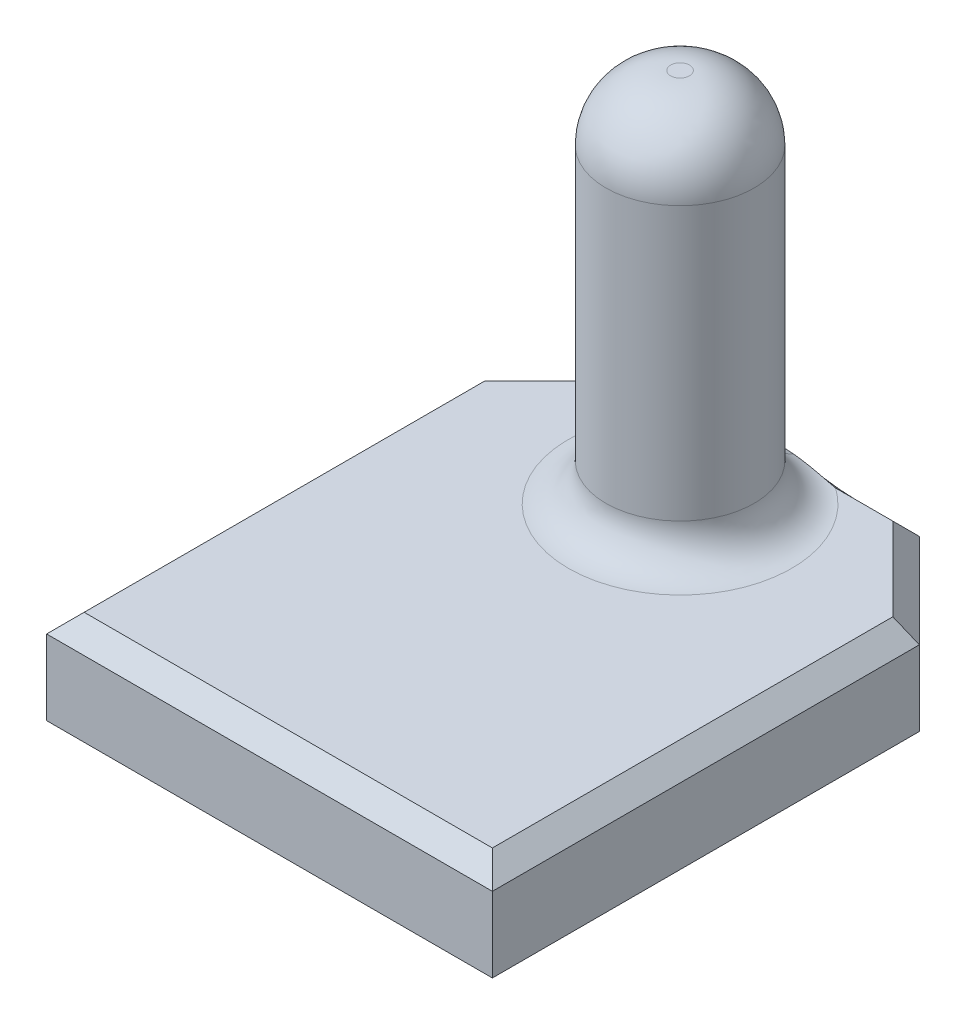
ISO-10303-21;
HEADER;
FILE_DESCRIPTION(('STEP AP214'),'2;1');
FILE_NAME('part.step','',(''),(''),'','','');
FILE_SCHEMA(('AUTOMOTIVE_DESIGN { 1 0 10303 214 1 1 1 1 }'));
ENDSEC;
DATA;
#1=APPLICATION_CONTEXT('core data for automotive mechanical design processes');
#2=APPLICATION_PROTOCOL_DEFINITION('international standard','automotive_design',2000,#1);
#3=PRODUCT_CONTEXT('',#1,'mechanical');
#4=PRODUCT('Part','Part','',(#3));
#5=PRODUCT_RELATED_PRODUCT_CATEGORY('part','',(#4));
#6=PRODUCT_DEFINITION_FORMATION('','',#4);
#7=PRODUCT_DEFINITION_CONTEXT('part definition',#1,'design');
#8=PRODUCT_DEFINITION('design','',#6,#7);
#9=PRODUCT_DEFINITION_SHAPE('','',#8);
#10=(LENGTH_UNIT() NAMED_UNIT(*) SI_UNIT(.MILLI.,.METRE.));
#11=(NAMED_UNIT(*) PLANE_ANGLE_UNIT() SI_UNIT($,.RADIAN.));
#12=(NAMED_UNIT(*) SI_UNIT($,.STERADIAN.) SOLID_ANGLE_UNIT());
#13=UNCERTAINTY_MEASURE_WITH_UNIT(LENGTH_MEASURE(1.E-05),#10,'distance_accuracy_value','');
#14=(GEOMETRIC_REPRESENTATION_CONTEXT(3) GLOBAL_UNCERTAINTY_ASSIGNED_CONTEXT((#13)) GLOBAL_UNIT_ASSIGNED_CONTEXT((#10,
#11,#12)) REPRESENTATION_CONTEXT('',''));
#15=CARTESIAN_POINT('',(0.,0.,0.));
#16=DIRECTION('',(0.,0.,1.));
#17=DIRECTION('',(1.,0.,0.));
#18=AXIS2_PLACEMENT_3D('',#15,#16,#17);
#19=CARTESIAN_POINT('',(11.875,5.,13.875));
#20=DIRECTION('',(-1.,0.,0.));
#21=DIRECTION('',(0.,0.,1.));
#22=AXIS2_PLACEMENT_3D('',#19,#20,#21);
#23=PLANE('',#22);
#24=DIRECTION('',(0.,1.,0.));
#25=VECTOR('',#24,1.);
#26=CARTESIAN_POINT('',(11.875,5.,-8.87499999999998));
#27=LINE('',#26,#25);
#28=CARTESIAN_POINT('',(11.875,0.,-8.87499999999998));
#29=VERTEX_POINT('',#28);
#30=CARTESIAN_POINT('',(11.875,4.00000000000001,-8.87499999999998));
#31=VERTEX_POINT('',#30);
#32=EDGE_CURVE('E503',#29,#31,#27,.T.);
#33=ORIENTED_EDGE('',*,*,#32,.T.);
#34=DIRECTION('',(0.,0.,1.));
#35=VECTOR('',#34,1.);
#36=CARTESIAN_POINT('',(11.875,4.00000000000001,13.875));
#37=LINE('',#36,#35);
#38=CARTESIAN_POINT('',(11.875,4.00000000000001,13.875));
#39=VERTEX_POINT('',#38);
#40=EDGE_CURVE('E320',#31,#39,#37,.T.);
#41=ORIENTED_EDGE('',*,*,#40,.T.);
#42=DIRECTION('',(0.,-1.,0.));
#43=VECTOR('',#42,1.);
#44=CARTESIAN_POINT('',(11.875,5.,13.875));
#45=LINE('',#44,#43);
#46=CARTESIAN_POINT('',(11.875,0.,13.875));
#47=VERTEX_POINT('',#46);
#48=EDGE_CURVE('E158',#39,#47,#45,.T.);
#49=ORIENTED_EDGE('',*,*,#48,.T.);
#50=DIRECTION('',(0.,0.,-1.));
#51=VECTOR('',#50,1.);
#52=CARTESIAN_POINT('',(11.875,0.,13.875));
#53=LINE('',#52,#51);
#54=EDGE_CURVE('E170',#47,#29,#53,.T.);
#55=ORIENTED_EDGE('',*,*,#54,.T.);
#56=EDGE_LOOP('',(#33,#41,#49,#55));
#57=FACE_BOUND('',#56,.T.);
#58=ADVANCED_FACE('F47',(#57),#23,.F.);
#59=CARTESIAN_POINT('',(-11.875,5.,-13.875));
#60=DIRECTION('',(0.,0.,1.));
#61=DIRECTION('',(1.,0.,0.));
#62=AXIS2_PLACEMENT_3D('',#59,#60,#61);
#63=PLANE('',#62);
#64=CARTESIAN_POINT('',(3.41128641424315,4.00000000000001,-13.875));
#65=CARTESIAN_POINT('',(3.19115001990857,4.00000008711006,-13.875));
#66=CARTESIAN_POINT('',(2.97154695151907,4.00796390785185,-13.875));
#67=CARTESIAN_POINT('',(2.53297878569037,4.03341786411443,-13.875));
#68=CARTESIAN_POINT('',(2.31401396208884,4.05091208841774,-13.875));
#69=CARTESIAN_POINT('',(1.87628490233183,4.08889575065868,-13.875));
#70=CARTESIAN_POINT('',(1.65751822908087,4.10934879344183,-13.875));
#71=CARTESIAN_POINT('',(1.21975158726292,4.1467712798864,-13.875));
#72=CARTESIAN_POINT('',(1.00074810064412,4.16368817636872,-13.875));
#73=CARTESIAN_POINT('',(0.781444170076225,4.17611878517583,-13.875));
#74=B_SPLINE_CURVE_WITH_KNOTS('',3,(#64,#65,#66,#67,#68,#69,#70,#71,#72,#73),.UNSPECIFIED.,.F.,
.F.,(4,2,2,2,4),(0.,0.000658933231428684,0.00131786646285737,0.00197679969428605,
0.00263573292571474),.UNSPECIFIED.);
#75=CARTESIAN_POINT('',(0.781444170076225,4.17611878517583,-13.875));
#76=VERTEX_POINT('',#75);
#77=CARTESIAN_POINT('',(3.41128641424315,4.00000000000001,-13.875));
#78=VERTEX_POINT('',#77);
#79=EDGE_CURVE('E286',#76,#78,#74,.F.);
#80=ORIENTED_EDGE('',*,*,#79,.T.);
#81=DIRECTION('',(1.,0.,0.));
#82=VECTOR('',#81,1.);
#83=CARTESIAN_POINT('',(-11.875,4.00000000000001,-13.875));
#84=LINE('',#83,#82);
#85=CARTESIAN_POINT('',(6.87500000000001,4.00000000000001,-13.875));
#86=VERTEX_POINT('',#85);
#87=EDGE_CURVE('E291',#78,#86,#84,.T.);
#88=ORIENTED_EDGE('',*,*,#87,.T.);
#89=DIRECTION('',(0.,-1.,0.));
#90=VECTOR('',#89,1.);
#91=CARTESIAN_POINT('',(6.87500000000001,5.,-13.875));
#92=LINE('',#91,#90);
#93=CARTESIAN_POINT('',(6.87500000000001,0.,-13.875));
#94=VERTEX_POINT('',#93);
#95=EDGE_CURVE('E533',#86,#94,#92,.T.);
#96=ORIENTED_EDGE('',*,*,#95,.T.);
#97=DIRECTION('',(-1.,0.,0.));
#98=VECTOR('',#97,1.);
#99=CARTESIAN_POINT('',(-11.875,0.,-13.875));
#100=LINE('',#99,#98);
#101=CARTESIAN_POINT('',(-6.87499999999999,0.,-13.875));
#102=VERTEX_POINT('',#101);
#103=EDGE_CURVE('E166',#94,#102,#100,.T.);
#104=ORIENTED_EDGE('',*,*,#103,.T.);
#105=DIRECTION('',(0.,1.,0.));
#106=VECTOR('',#105,1.);
#107=CARTESIAN_POINT('',(-6.87499999999999,5.,-13.875));
#108=LINE('',#107,#106);
#109=CARTESIAN_POINT('',(-6.87499999999999,4.00000000000001,-13.875));
#110=VERTEX_POINT('',#109);
#111=EDGE_CURVE('E508',#102,#110,#108,.T.);
#112=ORIENTED_EDGE('',*,*,#111,.T.);
#113=DIRECTION('',(1.,0.,0.));
#114=VECTOR('',#113,1.);
#115=CARTESIAN_POINT('',(-11.875,4.00000000000001,-13.875));
#116=LINE('',#115,#114);
#117=CARTESIAN_POINT('',(-3.41128641424316,4.00000000000001,-13.875));
#118=VERTEX_POINT('',#117);
#119=EDGE_CURVE('E259',#110,#118,#116,.T.);
#120=ORIENTED_EDGE('',*,*,#119,.T.);
#121=CARTESIAN_POINT('',(-0.781444170076225,4.17611878517583,-13.875));
#122=CARTESIAN_POINT('',(-1.00074810064412,4.16368817636873,-13.875));
#123=CARTESIAN_POINT('',(-1.21975158726292,4.14677127988637,-13.875));
#124=CARTESIAN_POINT('',(-1.65751822908087,4.10934879344186,-13.875));
#125=CARTESIAN_POINT('',(-1.87628490233183,4.08889575065866,-13.875));
#126=CARTESIAN_POINT('',(-2.31401396208884,4.05091208841776,-13.875));
#127=CARTESIAN_POINT('',(-2.53297878569038,4.03341786411443,-13.875));
#128=CARTESIAN_POINT('',(-2.97154695151907,4.00796390785185,-13.875));
#129=CARTESIAN_POINT('',(-3.19115001990858,4.00000008711006,-13.875));
#130=CARTESIAN_POINT('',(-3.41128641424316,4.00000000000001,-13.875));
#131=B_SPLINE_CURVE_WITH_KNOTS('',3,(#121,#122,#123,#124,#125,#126,#127,#128,#129,#130),
.UNSPECIFIED.,.F.,.F.,(4,2,2,2,4),(0.,0.000658933231428685,0.00131786646285737,
0.00197679969428605,0.00263573292571474),.UNSPECIFIED.);
#132=CARTESIAN_POINT('',(-0.781444170076225,4.17611878517583,-13.875));
#133=VERTEX_POINT('',#132);
#134=EDGE_CURVE('E254',#118,#133,#131,.F.);
#135=ORIENTED_EDGE('',*,*,#134,.T.);
#136=CARTESIAN_POINT('',(0.781444170076225,4.17611878517583,-13.875));
#137=CARTESIAN_POINT('',(0.520962780050819,4.19086411335815,-13.875));
#138=CARTESIAN_POINT('',(0.260481392587462,4.1978121142284,-13.875));
#139=CARTESIAN_POINT('',(-0.260481392587462,4.19781211422842,-13.875));
#140=CARTESIAN_POINT('',(-0.520962780050816,4.19086411335814,-13.875));
#141=CARTESIAN_POINT('',(-0.781444170076227,4.17611878517583,-13.875));
#142=B_SPLINE_CURVE_WITH_KNOTS('',3,(#136,#137,#138,#139,#140,#141),.UNSPECIFIED.,.F.,.F.,(4,2,
4),(0.,0.000781444170076226,0.00156288834015245),.UNSPECIFIED.);
#143=EDGE_CURVE('E611',#133,#76,#142,.F.);
#144=ORIENTED_EDGE('',*,*,#143,.T.);
#145=EDGE_LOOP('',(#80,#88,#96,#104,#112,#120,#135,#144));
#146=FACE_BOUND('',#145,.T.);
#147=ADVANCED_FACE('F261',(#146),#63,.F.);
#148=CARTESIAN_POINT('',(-11.875,5.,13.875));
#149=DIRECTION('',(1.,0.,0.));
#150=DIRECTION('',(0.,0.,-1.));
#151=AXIS2_PLACEMENT_3D('',#148,#149,#150);
#152=PLANE('',#151);
#153=DIRECTION('',(0.,-1.,0.));
#154=VECTOR('',#153,1.);
#155=CARTESIAN_POINT('',(-11.875,5.,13.875));
#156=LINE('',#155,#154);
#157=CARTESIAN_POINT('',(-11.875,4.00000000000001,13.875));
#158=VERTEX_POINT('',#157);
#159=CARTESIAN_POINT('',(-11.875,0.,13.875));
#160=VERTEX_POINT('',#159);
#161=EDGE_CURVE('E150',#158,#160,#156,.T.);
#162=ORIENTED_EDGE('',*,*,#161,.F.);
#163=DIRECTION('',(0.,0.,-1.));
#164=VECTOR('',#163,1.);
#165=CARTESIAN_POINT('',(-11.875,4.00000000000001,13.875));
#166=LINE('',#165,#164);
#167=CARTESIAN_POINT('',(-11.875,4.00000000000001,-8.87500000000001));
#168=VERTEX_POINT('',#167);
#169=EDGE_CURVE('E59',#158,#168,#166,.T.);
#170=ORIENTED_EDGE('',*,*,#169,.T.);
#171=DIRECTION('',(0.,-1.,0.));
#172=VECTOR('',#171,1.);
#173=CARTESIAN_POINT('',(-11.875,5.,-8.87500000000001));
#174=LINE('',#173,#172);
#175=CARTESIAN_POINT('',(-11.875,0.,-8.87500000000001));
#176=VERTEX_POINT('',#175);
#177=EDGE_CURVE('E163',#168,#176,#174,.T.);
#178=ORIENTED_EDGE('',*,*,#177,.T.);
#179=DIRECTION('',(0.,0.,1.));
#180=VECTOR('',#179,1.);
#181=CARTESIAN_POINT('',(-11.875,0.,13.875));
#182=LINE('',#181,#180);
#183=EDGE_CURVE('E161',#176,#160,#182,.T.);
#184=ORIENTED_EDGE('',*,*,#183,.T.);
#185=EDGE_LOOP('',(#162,#170,#178,#184));
#186=FACE_BOUND('',#185,.T.);
#187=ADVANCED_FACE('F162',(#186),#152,.F.);
#188=CARTESIAN_POINT('',(-11.875,5.,13.875));
#189=DIRECTION('',(0.,0.,-1.));
#190=DIRECTION('',(-1.,0.,0.));
#191=AXIS2_PLACEMENT_3D('',#188,#189,#190);
#192=PLANE('',#191);
#193=ORIENTED_EDGE('',*,*,#48,.F.);
#194=DIRECTION('',(-1.,0.,0.));
#195=VECTOR('',#194,1.);
#196=CARTESIAN_POINT('',(-11.875,4.00000000000001,13.875));
#197=LINE('',#196,#195);
#198=EDGE_CURVE('E74',#39,#158,#197,.T.);
#199=ORIENTED_EDGE('',*,*,#198,.T.);
#200=ORIENTED_EDGE('',*,*,#161,.T.);
#201=DIRECTION('',(1.,0.,0.));
#202=VECTOR('',#201,1.);
#203=CARTESIAN_POINT('',(-11.875,0.,13.875));
#204=LINE('',#203,#202);
#205=EDGE_CURVE('E154',#160,#47,#204,.T.);
#206=ORIENTED_EDGE('',*,*,#205,.T.);
#207=EDGE_LOOP('',(#193,#199,#200,#206));
#208=FACE_BOUND('',#207,.T.);
#209=ADVANCED_FACE('F152',(#208),#192,.F.);
#210=CARTESIAN_POINT('',(0.,5.,0.));
#211=DIRECTION('',(0.,-1.,0.));
#212=DIRECTION('',(0.,0.,-1.));
#213=AXIS2_PLACEMENT_3D('',#210,#211,#212);
#214=PLANE('',#213);
#215=DIRECTION('',(-0.707106781186546,0.,-0.707106781186549));
#216=VECTOR('',#215,1.);
#217=CARTESIAN_POINT('',(6.16789321881346,5.,-13.1678932188135));
#218=LINE('',#217,#216);
#219=CARTESIAN_POINT('',(10.875,5.,-8.46078643762689));
#220=VERTEX_POINT('',#219);
#221=CARTESIAN_POINT('',(6.46078643762691,5.,-12.875));
#222=VERTEX_POINT('',#221);
#223=EDGE_CURVE('E312',#220,#222,#218,.T.);
#224=ORIENTED_EDGE('',*,*,#223,.T.);
#225=DIRECTION('',(-1.,0.,0.));
#226=VECTOR('',#225,1.);
#227=CARTESIAN_POINT('',(0.,5.,-12.875));
#228=LINE('',#227,#226);
#229=CARTESIAN_POINT('',(3.41128641424316,5.,-12.875));
#230=VERTEX_POINT('',#229);
#231=EDGE_CURVE('E314',#222,#230,#228,.T.);
#232=ORIENTED_EDGE('',*,*,#231,.T.);
#233=CARTESIAN_POINT('',(0.,5.,-8.));
#234=DIRECTION('',(0.,-1.,0.));
#235=DIRECTION('',(0.,0.,-1.));
#236=AXIS2_PLACEMENT_3D('',#233,#234,#235);
#237=CIRCLE('',#236,5.95);
#238=CARTESIAN_POINT('',(-3.41128641424316,5.,-12.875));
#239=VERTEX_POINT('',#238);
#240=EDGE_CURVE('E191',#230,#239,#237,.T.);
#241=ORIENTED_EDGE('',*,*,#240,.T.);
#242=DIRECTION('',(-1.,0.,0.));
#243=VECTOR('',#242,1.);
#244=CARTESIAN_POINT('',(0.,5.,-12.875));
#245=LINE('',#244,#243);
#246=CARTESIAN_POINT('',(-6.4607864376269,5.,-12.875));
#247=VERTEX_POINT('',#246);
#248=EDGE_CURVE('E298',#239,#247,#245,.T.);
#249=ORIENTED_EDGE('',*,*,#248,.T.);
#250=DIRECTION('',(-0.707106781186549,0.,0.707106781186547));
#251=VECTOR('',#250,1.);
#252=CARTESIAN_POINT('',(-11.1678932188135,5.,-8.16789321881347));
#253=LINE('',#252,#251);
#254=CARTESIAN_POINT('',(-10.875,5.,-8.46078643762692));
#255=VERTEX_POINT('',#254);
#256=EDGE_CURVE('E302',#247,#255,#253,.T.);
#257=ORIENTED_EDGE('',*,*,#256,.T.);
#258=DIRECTION('',(0.,0.,1.));
#259=VECTOR('',#258,1.);
#260=CARTESIAN_POINT('',(-10.875,5.,0.));
#261=LINE('',#260,#259);
#262=CARTESIAN_POINT('',(-10.875,5.,12.875));
#263=VERTEX_POINT('',#262);
#264=EDGE_CURVE('E306',#255,#263,#261,.T.);
#265=ORIENTED_EDGE('',*,*,#264,.T.);
#266=DIRECTION('',(1.,0.,0.));
#267=VECTOR('',#266,1.);
#268=CARTESIAN_POINT('',(0.,5.,12.875));
#269=LINE('',#268,#267);
#270=CARTESIAN_POINT('',(10.875,5.,12.875));
#271=VERTEX_POINT('',#270);
#272=EDGE_CURVE('E308',#263,#271,#269,.T.);
#273=ORIENTED_EDGE('',*,*,#272,.T.);
#274=DIRECTION('',(0.,0.,-1.));
#275=VECTOR('',#274,1.);
#276=CARTESIAN_POINT('',(10.875,5.,0.));
#277=LINE('',#276,#275);
#278=EDGE_CURVE('E310',#271,#220,#277,.T.);
#279=ORIENTED_EDGE('',*,*,#278,.T.);
#280=EDGE_LOOP('',(#224,#232,#241,#249,#257,#265,#273,#279));
#281=FACE_BOUND('',#280,.T.);
#282=ADVANCED_FACE('F517',(#281),#214,.F.);
#283=CARTESIAN_POINT('',(0.,0.,0.));
#284=DIRECTION('',(0.,-1.,0.));
#285=DIRECTION('',(0.,0.,-1.));
#286=AXIS2_PLACEMENT_3D('',#283,#284,#285);
#287=PLANE('',#286);
#288=ORIENTED_EDGE('',*,*,#183,.F.);
#289=DIRECTION('',(-0.707106781186549,0.,0.707106781186547));
#290=VECTOR('',#289,1.);
#291=CARTESIAN_POINT('',(-10.375,0.,-10.375));
#292=LINE('',#291,#290);
#293=EDGE_CURVE('E535',#176,#102,#292,.F.);
#294=ORIENTED_EDGE('',*,*,#293,.T.);
#295=ORIENTED_EDGE('',*,*,#103,.F.);
#296=DIRECTION('',(-0.707106781186546,0.,-0.707106781186549));
#297=VECTOR('',#296,1.);
#298=CARTESIAN_POINT('',(10.375,0.,-10.375));
#299=LINE('',#298,#297);
#300=EDGE_CURVE('E730',#94,#29,#299,.F.);
#301=ORIENTED_EDGE('',*,*,#300,.T.);
#302=ORIENTED_EDGE('',*,*,#54,.F.);
#303=ORIENTED_EDGE('',*,*,#205,.F.);
#304=EDGE_LOOP('',(#288,#294,#295,#301,#302,#303));
#305=FACE_BOUND('',#304,.T.);
#306=ADVANCED_FACE('F168',(#305),#287,.T.);
#307=CARTESIAN_POINT('',(0.,25.,-8.));
#308=DIRECTION('',(0.,-1.,0.));
#309=DIRECTION('',(0.,0.,-1.));
#310=AXIS2_PLACEMENT_3D('',#307,#308,#309);
#311=CYLINDRICAL_SURFACE('',#310,3.95);
#312=CARTESIAN_POINT('',(0.,7.,-8.));
#313=DIRECTION('',(0.,-1.,0.));
#314=DIRECTION('',(0.,0.,-1.));
#315=AXIS2_PLACEMENT_3D('',#312,#313,#314);
#316=CIRCLE('',#315,3.95);
#317=CARTESIAN_POINT('',(-0.625189011741655,7.,-11.9002100840336));
#318=VERTEX_POINT('',#317);
#319=CARTESIAN_POINT('',(0.625189011741655,7.,-11.9002100840336));
#320=VERTEX_POINT('',#319);
#321=EDGE_CURVE('E180',#318,#320,#316,.F.);
#322=ORIENTED_EDGE('',*,*,#321,.T.);
#323=CARTESIAN_POINT('',(1.53050169006895,6.96164679516457,-11.6414371581418));
#324=CARTESIAN_POINT('',(1.36076939016843,4.57034626097767,-11.7127759072608));
#325=CARTESIAN_POINT('',(2.30543925466082,5.,-13.875));
#326=CARTESIAN_POINT('',(1.48158300460447,6.96779390109386,-11.6619986475371));
#327=CARTESIAN_POINT('',(1.33278243601276,4.60737958647044,-11.7218977358061));
#328=CARTESIAN_POINT('',(2.23175161452192,5.,-13.875));
#329=CARTESIAN_POINT('',(1.43221184552606,6.97290350872281,-11.6815884547281));
#330=CARTESIAN_POINT('',(1.30152856582844,4.64232919478607,-11.7321929191556));
#331=CARTESIAN_POINT('',(2.15738240021702,5.,-13.875));
#332=CARTESIAN_POINT('',(1.33267176922052,6.98144314836983,-11.7187776576585));
#333=CARTESIAN_POINT('',(1.23381418687742,4.70744547984949,-11.7539585008105));
#334=CARTESIAN_POINT('',(2.00744228528788,5.,-13.875));
#335=CARTESIAN_POINT('',(1.28250299862953,6.98487348550816,-11.7363774145389));
#336=CARTESIAN_POINT('',(1.19738237617799,4.7377257719435,-11.765426863285));
#337=CARTESIAN_POINT('',(1.93187160554592,5.,-13.875));
#338=CARTESIAN_POINT('',(1.13101284067651,6.99323683511533,-11.7861058934016));
#339=CARTESIAN_POINT('',(1.08229211280292,4.8211202476652,-11.7999288371654));
#340=CARTESIAN_POINT('',(1.70367757015737,5.,-13.875));
#341=CARTESIAN_POINT('',(1.02863102613744,6.99625053313701,-11.8151960161524));
#342=CARTESIAN_POINT('',(0.996318260832994,4.86847611492295,-11.8235977539001));
#343=CARTESIAN_POINT('',(1.54945686216286,5.,-13.875));
#344=CARTESIAN_POINT('',(0.82447035577066,6.99960614728282,-11.8643887473936));
#345=CARTESIAN_POINT('',(0.815039138607493,4.94586922838323,-11.8660714960783));
#346=CARTESIAN_POINT('',(1.24192370045837,5.,-13.875));
#347=CARTESIAN_POINT('',(0.722741495117046,7.00001357417123,-11.8846996534062));
#348=CARTESIAN_POINT('',(0.719751150842671,4.97679982645334,-11.8851703855837));
#349=CARTESIAN_POINT('',(1.08868655593411,5.,-13.875));
#350=CARTESIAN_POINT('',(0.517988703455294,6.99998575346423,-11.9172609062288));
#351=CARTESIAN_POINT('',(0.52253243489614,5.02519746886763,-11.9165430850874));
#352=CARTESIAN_POINT('',(0.78026146470017,5.,-13.875));
#353=CARTESIAN_POINT('',(0.414964641529029,6.99955041999159,-11.9295104314141));
#354=CARTESIAN_POINT('',(0.420102903725144,5.04296620889305,-11.9289898654874));
#355=CARTESIAN_POINT('',(0.625073320784691,5.,-13.875));
#356=CARTESIAN_POINT('',(0.206213362562508,6.99884873312505,-11.9460303202092));
#357=CARTESIAN_POINT('',(0.210340552346186,5.06662980210427,-11.9458192072689));
#358=CARTESIAN_POINT('',(0.310625191707616,5.,-13.875));
#359=CARTESIAN_POINT('',(0.100473152128987,6.99858591494243,-11.9501370425112));
#360=CARTESIAN_POINT('',(0.102305476000305,5.07243207960994,-11.9501411882996));
#361=CARTESIAN_POINT('',(0.151345634219489,5.,-13.875));
#362=CARTESIAN_POINT('',(-0.110992481984468,6.99860099226305,-11.9498559539244));
#363=CARTESIAN_POINT('',(-0.113028426188587,5.07203461840136,-11.9498515368595));
#364=CARTESIAN_POINT('',(-0.16719120703977,5.,-13.875));
#365=CARTESIAN_POINT('',(-0.216717905531267,6.99887889235614,-11.9454680709297));
#366=CARTESIAN_POINT('',(-0.221001156330082,5.06583229207546,-11.9452379977118));
#367=CARTESIAN_POINT('',(-0.326448490610355,5.,-13.875));
#368=CARTESIAN_POINT('',(-0.430255081481649,6.99960759831694,-11.9279958060119));
#369=CARTESIAN_POINT('',(-0.435403492960876,5.0407788529233,-11.9274502411586));
#370=CARTESIAN_POINT('',(-0.648105755649607,5.,-13.875));
#371=CARTESIAN_POINT('',(-0.538048829660861,7.00006274776311,-11.9146863627795));
#372=CARTESIAN_POINT('',(-0.542379244398583,5.02143473020195,-11.9139400368094));
#373=CARTESIAN_POINT('',(-0.810478616830925,5.,-13.875));
#374=CARTESIAN_POINT('',(-0.698622952781542,6.99995967694798,-11.8881066364999));
#375=CARTESIAN_POINT('',(-0.695779792486603,4.98190450958226,-11.8885921791466));
#376=CARTESIAN_POINT('',(-1.05235609343042,5.,-13.875));
#377=CARTESIAN_POINT('',(-0.751969779468752,6.99979426739182,-11.8781420716075));
#378=CARTESIAN_POINT('',(-0.746100878660888,4.96684169453878,-11.8792153931648));
#379=CARTESIAN_POINT('',(-1.13271397160483,5.,-13.875));
#380=CARTESIAN_POINT('',(-0.858206833231929,6.99896053763323,-11.8560244171546));
#381=CARTESIAN_POINT('',(-0.844068846901832,4.93289763612209,-11.8591175660032));
#382=CARTESIAN_POINT('',(-1.29274193866582,5.,-13.875));
#383=CARTESIAN_POINT('',(-0.911097052590524,6.99829220894746,-11.8438712906798));
#384=CARTESIAN_POINT('',(-0.891772322981574,4.91395703789395,-11.8483690593193));
#385=CARTESIAN_POINT('',(-1.3724120159275,5.,-13.875));
#386=CARTESIAN_POINT('',(-0.96371874042932,6.99725200756799,-11.8306326095497));
#387=CARTESIAN_POINT('',(-0.937593131539536,4.89306593338415,-11.8372053460813));
#388=CARTESIAN_POINT('',(-1.4516775963429,5.,-13.875));
#389=(BOUNDED_SURFACE() B_SPLINE_SURFACE(3,2,((#323,#324,#325),(#326,#327,#328),(#329,#330,
#331),(#332,#333,#334),(#335,#336,#337),(#338,#339,#340),(#341,#342,#343),(#344,#345,#346),
(#347,#348,#349),(#350,#351,#352),(#353,#354,#355),(#356,#357,#358),(#359,#360,#361),(#362,#363,
#364),(#365,#366,#367),(#368,#369,#370),(#371,#372,#373),(#374,#375,#376),(#377,#378,#379),
(#380,#381,#382),(#383,#384,#385),(#386,#387,#388)),.UNSPECIFIED.,.F.,.F.,
.F.) B_SPLINE_SURFACE_WITH_KNOTS((4,2,2,2,2,2,2,2,2,2,4),(3,3),(0.,0.240449943020466,
0.48085618051423,0.961293746290322,1.42960604256209,1.89796606234513,2.37564672632531,
2.8533314450825,3.34354420130904,3.58872678361972,3.83391350181491),(0.,1.),
.UNSPECIFIED.) GEOMETRIC_REPRESENTATION_ITEM() RATIONAL_B_SPLINE_SURFACE(((1.,0.640439822186455,
1.),(1.,0.645617196698053,1.),(1.,0.650580503473475,1.),(1.,0.660048938736722,1.),(1.,
0.664554150341615,1.),(1.,0.677333661911925,1.),(1.,0.684880001443973,1.),(1.,0.697701007575124,
1.),(1.,0.703028199910372,1.),(1.,0.71159039553581,1.),(1.,0.714825185565498,1.),(1.,
0.719191198053565,1.),(1.,0.720279277174465,1.),(1.,0.720204897908382,1.),(1.,0.719042420417704,
1.),(1.,0.714425100764005,1.),(1.,0.710910937301905,1.),(1.,0.70392577328601,1.),(1.,
0.701311192657049,1.),(1.,0.695523642029179,1.),(1.,0.692350662611772,1.),(1.,0.68890504362287,1.))) REPRESENTATION_ITEM('') SURFACE());
#390=CARTESIAN_POINT('',(1.53050169006895,6.96164679516457,-11.6414371581418));
#391=CARTESIAN_POINT('',(1.48158300460447,6.96779390109386,-11.6619986475371));
#392=CARTESIAN_POINT('',(1.43221184552606,6.97290350872281,-11.6815884547281));
#393=CARTESIAN_POINT('',(1.33267176922052,6.98144314836983,-11.7187776576585));
#394=CARTESIAN_POINT('',(1.28250299862953,6.98487348550816,-11.7363774145389));
#395=CARTESIAN_POINT('',(1.13101284067651,6.99323683511533,-11.7861058934016));
#396=CARTESIAN_POINT('',(1.02863102613744,6.99625053313701,-11.8151960161524));
#397=CARTESIAN_POINT('',(0.82447035577066,6.99960614728282,-11.8643887473936));
#398=CARTESIAN_POINT('',(0.722741495117046,7.00001357417123,-11.8846996534062));
#399=CARTESIAN_POINT('',(0.517988703455294,6.99998575346423,-11.9172609062288));
#400=CARTESIAN_POINT('',(0.414964641529029,6.99955041999159,-11.9295104314141));
#401=CARTESIAN_POINT('',(0.206213362562508,6.99884873312504,-11.9460303202092));
#402=CARTESIAN_POINT('',(0.100473152128987,6.99858591494242,-11.9501370425112));
#403=CARTESIAN_POINT('',(-0.110992481984468,6.99860099226305,-11.9498559539244));
#404=CARTESIAN_POINT('',(-0.216717905531267,6.99887889235614,-11.9454680709297));
#405=CARTESIAN_POINT('',(-0.430255081481649,6.99960759831694,-11.9279958060119));
#406=CARTESIAN_POINT('',(-0.538048829660861,7.00006274776311,-11.9146863627795));
#407=CARTESIAN_POINT('',(-0.698622952781542,6.99995967694798,-11.8881066364999));
#408=CARTESIAN_POINT('',(-0.751969779468752,6.99979426739182,-11.8781420716075));
#409=CARTESIAN_POINT('',(-0.858206833231929,6.99896053763323,-11.8560244171546));
#410=CARTESIAN_POINT('',(-0.911097052590524,6.99829220894746,-11.8438712906798));
#411=CARTESIAN_POINT('',(-0.96371874042932,6.99725200756799,-11.8306326095497));
#412=B_SPLINE_CURVE_WITH_KNOTS('',3,(#390,#391,#392,#393,#394,#395,#396,#397,#398,#399,#400,
#401,#402,#403,#404,#405,#406,#407,#408,#409,#410,#411),.UNSPECIFIED.,.F.,.F.,(4,2,2,2,2,2,2,2,
2,2,4),(0.,0.240449943020466,0.48085618051423,0.961293746290322,1.42960604256209,
1.89796606234513,2.37564672632531,2.8533314450825,3.34354420130904,3.58872678361972,
3.83391350181491),.UNSPECIFIED.);
#413=EDGE_CURVE('E182',#320,#318,#412,.T.);
#414=ORIENTED_EDGE('',*,*,#413,.T.);
#415=EDGE_LOOP('',(#322,#414));
#416=FACE_BOUND('',#415,.T.);
#417=CARTESIAN_POINT('',(0.,21.55,-8.));
#418=DIRECTION('',(0.,1.,0.));
#419=DIRECTION('',(0.,0.,1.));
#420=AXIS2_PLACEMENT_3D('',#417,#418,#419);
#421=CIRCLE('',#420,3.95);
#422=CARTESIAN_POINT('',(0.,21.55,-4.05));
#423=VERTEX_POINT('',#422);
#424=EDGE_CURVE('E177',#423,#423,#421,.F.);
#425=ORIENTED_EDGE('',*,*,#424,.T.);
#426=EDGE_LOOP('',(#425));
#427=FACE_BOUND('',#426,.T.);
#428=ADVANCED_FACE('F194',(#416,#427),#311,.T.);
#429=CARTESIAN_POINT('',(0.,25.,-8.));
#430=DIRECTION('',(0.,1.,0.));
#431=DIRECTION('',(0.,0.,1.));
#432=AXIS2_PLACEMENT_3D('',#429,#430,#431);
#433=PLANE('',#432);
#434=CARTESIAN_POINT('',(0.,25.,-8.));
#435=DIRECTION('',(0.,1.,0.));
#436=DIRECTION('',(0.,0.,1.));
#437=AXIS2_PLACEMENT_3D('',#434,#435,#436);
#438=CIRCLE('',#437,0.5);
#439=CARTESIAN_POINT('',(0.,25.,-7.5));
#440=VERTEX_POINT('',#439);
#441=EDGE_CURVE('E157',#440,#440,#438,.T.);
#442=ORIENTED_EDGE('',*,*,#441,.T.);
#443=EDGE_LOOP('',(#442));
#444=FACE_BOUND('',#443,.T.);
#445=ADVANCED_FACE('F687',(#444),#433,.T.);
#446=CARTESIAN_POINT('',(0.,21.55,-8.));
#447=DIRECTION('',(0.,1.,0.));
#448=DIRECTION('',(0.,0.,1.));
#449=AXIS2_PLACEMENT_3D('',#446,#447,#448);
#450=DEGENERATE_TOROIDAL_SURFACE('',#449,0.5,3.45,.T.);
#451=ORIENTED_EDGE('',*,*,#424,.F.);
#452=EDGE_LOOP('',(#451));
#453=FACE_BOUND('',#452,.T.);
#454=ORIENTED_EDGE('',*,*,#441,.F.);
#455=EDGE_LOOP('',(#454));
#456=FACE_BOUND('',#455,.T.);
#457=ADVANCED_FACE('F201',(#453,#456),#450,.T.);
#458=CARTESIAN_POINT('',(0.,7.,-8.));
#459=DIRECTION('',(0.,-1.,0.));
#460=DIRECTION('',(0.,0.,-1.));
#461=AXIS2_PLACEMENT_3D('',#458,#459,#460);
#462=TOROIDAL_SURFACE('',#461,5.95,2.);
#463=CARTESIAN_POINT('',(-0.94174041009186,7.,-13.875));
#464=DIRECTION('',(-0.987394957983193,0.,0.158275699175103));
#465=DIRECTION('',(0.158275699175103,0.,0.987394957983194));
#466=AXIS2_PLACEMENT_3D('',#463,#464,#465);
#467=CIRCLE('',#466,2.);
#468=CARTESIAN_POINT('',(-0.834876250081436,5.11741252345055,-13.2083333333333));
#469=VERTEX_POINT('',#468);
#470=EDGE_CURVE('E343',#469,#318,#467,.T.);
#471=ORIENTED_EDGE('',*,*,#470,.F.);
#472=CARTESIAN_POINT('',(-3.41128641424316,5.,-12.875));
#473=CARTESIAN_POINT('',(-3.21527473415048,5.00000005807336,-12.9094625345124));
#474=CARTESIAN_POINT('',(-3.01500141182326,5.0053092718992,-12.9438380799256));
#475=CARTESIAN_POINT('',(-2.60480598296443,5.02227857607831,-13.0103568344137));
#476=CARTESIAN_POINT('',(-2.39485139989262,5.03394139227817,-13.0424974104849));
#477=CARTESIAN_POINT('',(-1.96493020494231,5.05926383377277,-13.101855539628));
#478=CARTESIAN_POINT('',(-1.74493606257509,5.07289919563166,-13.1290438712621));
#479=CARTESIAN_POINT('',(-1.29595897000456,5.09784751992049,-13.1754212849904));
#480=CARTESIAN_POINT('',(-1.06698278385162,5.1091254509124,-13.1945736737954));
#481=CARTESIAN_POINT('',(-0.834876250081439,5.11741252345055,-13.2083333333333));
#482=B_SPLINE_CURVE_WITH_KNOTS('',3,(#472,#473,#474,#475,#476,#477,#478,#479,#480,#481),
.UNSPECIFIED.,.F.,.F.,(4,2,2,2,4),(0.,0.000658933231428685,0.00131786646285737,
0.00197679969428605,0.00263573292571474),.UNSPECIFIED.);
#483=EDGE_CURVE('E560',#469,#239,#482,.F.);
#484=ORIENTED_EDGE('',*,*,#483,.T.);
#485=ORIENTED_EDGE('',*,*,#240,.F.);
#486=CARTESIAN_POINT('',(0.834876250081436,5.11741252345055,-13.2083333333333));
#487=CARTESIAN_POINT('',(1.06698278385163,5.10912545091239,-13.1945736737954));
#488=CARTESIAN_POINT('',(1.29595897000456,5.09784751992051,-13.1754212849904));
#489=CARTESIAN_POINT('',(1.74493606257509,5.07289919563163,-13.1290438712621));
#490=CARTESIAN_POINT('',(1.96493020494231,5.05926383377279,-13.101855539628));
#491=CARTESIAN_POINT('',(2.39485139989262,5.03394139227815,-13.0424974104849));
#492=CARTESIAN_POINT('',(2.60480598296443,5.02227857607832,-13.0103568344137));
#493=CARTESIAN_POINT('',(3.01500141182326,5.00530927189919,-12.9438380799256));
#494=CARTESIAN_POINT('',(3.21527473415048,5.00000005807336,-12.9094625345124));
#495=CARTESIAN_POINT('',(3.41128641424315,5.,-12.875));
#496=B_SPLINE_CURVE_WITH_KNOTS('',3,(#486,#487,#488,#489,#490,#491,#492,#493,#494,#495),
.UNSPECIFIED.,.F.,.F.,(4,2,2,2,4),(0.,0.000658933231428684,0.00131786646285737,
0.00197679969428605,0.00263573292571474),.UNSPECIFIED.);
#497=CARTESIAN_POINT('',(0.834876250081437,5.11741252345055,-13.2083333333333));
#498=VERTEX_POINT('',#497);
#499=EDGE_CURVE('E557',#230,#498,#496,.F.);
#500=ORIENTED_EDGE('',*,*,#499,.T.);
#501=CARTESIAN_POINT('',(0.94174041009186,7.,-13.875));
#502=DIRECTION('',(0.987394957983194,0.,0.158275699175103));
#503=DIRECTION('',(0.158275699175103,0.,-0.987394957983193));
#504=AXIS2_PLACEMENT_3D('',#501,#502,#503);
#505=CIRCLE('',#504,2.);
#506=EDGE_CURVE('E539',#320,#498,#505,.T.);
#507=ORIENTED_EDGE('',*,*,#506,.F.);
#508=ORIENTED_EDGE('',*,*,#321,.F.);
#509=EDGE_LOOP('',(#471,#484,#485,#500,#507,#508));
#510=FACE_BOUND('',#509,.T.);
#511=ADVANCED_FACE('F209',(#510),#462,.F.);
#512=ORIENTED_EDGE('',*,*,#506,.T.);
#513=CARTESIAN_POINT('',(-0.834876250081437,5.11741252345055,-13.2083333333333));
#514=CARTESIAN_POINT('',(-0.554702989886011,5.12720363985834,-13.2253600481814));
#515=CARTESIAN_POINT('',(-0.277418051078742,5.1314058279081,-13.2333333333334));
#516=CARTESIAN_POINT('',(0.277418051078743,5.13140582790807,-13.2333333333334));
#517=CARTESIAN_POINT('',(0.554702989886018,5.12720363985835,-13.2253600481814));
#518=CARTESIAN_POINT('',(0.834876250081436,5.11741252345055,-13.2083333333333));
#519=B_SPLINE_CURVE_WITH_KNOTS('',3,(#513,#514,#515,#516,#517,#518),.UNSPECIFIED.,.F.,.F.,(4,2,
4),(0.,0.000781444170076226,0.00156288834015245),.UNSPECIFIED.);
#520=EDGE_CURVE('E507',#498,#469,#519,.F.);
#521=ORIENTED_EDGE('',*,*,#520,.T.);
#522=ORIENTED_EDGE('',*,*,#470,.T.);
#523=ORIENTED_EDGE('',*,*,#413,.F.);
#524=EDGE_LOOP('',(#512,#521,#522,#523));
#525=FACE_BOUND('',#524,.T.);
#526=ADVANCED_FACE('F203',(#525),#389,.F.);
#527=CARTESIAN_POINT('',(-11.875,5.,-8.87500000000001));
#528=DIRECTION('',(0.707106781186546,0.,0.707106781186548));
#529=DIRECTION('',(0.,-1.,0.));
#530=AXIS2_PLACEMENT_3D('',#527,#528,#529);
#531=PLANE('',#530);
#532=ORIENTED_EDGE('',*,*,#177,.F.);
#533=DIRECTION('',(-0.707106781186549,0.,0.707106781186547));
#534=VECTOR('',#533,1.);
#535=CARTESIAN_POINT('',(-6.87499999999999,4.00000000000001,-13.875));
#536=LINE('',#535,#534);
#537=EDGE_CURVE('E11',#168,#110,#536,.F.);
#538=ORIENTED_EDGE('',*,*,#537,.T.);
#539=ORIENTED_EDGE('',*,*,#111,.F.);
#540=ORIENTED_EDGE('',*,*,#293,.F.);
#541=EDGE_LOOP('',(#532,#538,#539,#540));
#542=FACE_BOUND('',#541,.T.);
#543=ADVANCED_FACE('F208',(#542),#531,.F.);
#544=CARTESIAN_POINT('',(6.87500000000001,5.,-13.875));
#545=DIRECTION('',(-0.707106781186549,0.,0.707106781186546));
#546=DIRECTION('',(0.,-1.,0.));
#547=AXIS2_PLACEMENT_3D('',#544,#545,#546);
#548=PLANE('',#547);
#549=ORIENTED_EDGE('',*,*,#95,.F.);
#550=DIRECTION('',(-0.707106781186546,0.,-0.707106781186549));
#551=VECTOR('',#550,1.);
#552=CARTESIAN_POINT('',(11.875,4.00000000000001,-8.87499999999998));
#553=LINE('',#552,#551);
#554=EDGE_CURVE('E316',#86,#31,#553,.F.);
#555=ORIENTED_EDGE('',*,*,#554,.T.);
#556=ORIENTED_EDGE('',*,*,#32,.F.);
#557=ORIENTED_EDGE('',*,*,#300,.F.);
#558=EDGE_LOOP('',(#549,#555,#556,#557));
#559=FACE_BOUND('',#558,.T.);
#560=ADVANCED_FACE('F372',(#559),#548,.F.);
#561=CARTESIAN_POINT('',(0.,5.,12.875));
#562=DIRECTION('',(0.,-0.707106781186547,-0.707106781186547));
#563=DIRECTION('',(1.,0.,0.));
#564=AXIS2_PLACEMENT_3D('',#561,#562,#563);
#565=PLANE('',#564);
#566=DIRECTION('',(0.577350269189626,0.577350269189626,-0.577350269189626));
#567=VECTOR('',#566,1.);
#568=CARTESIAN_POINT('',(-6.58333333333333,9.29166666666667,8.58333333333334));
#569=LINE('',#568,#567);
#570=EDGE_CURVE('E337',#158,#263,#569,.T.);
#571=ORIENTED_EDGE('',*,*,#570,.F.);
#572=ORIENTED_EDGE('',*,*,#198,.F.);
#573=DIRECTION('',(-0.577350269189626,0.577350269189626,-0.577350269189626));
#574=VECTOR('',#573,1.);
#575=CARTESIAN_POINT('',(7.25000000000001,8.625,9.25));
#576=LINE('',#575,#574);
#577=EDGE_CURVE('E340',#271,#39,#576,.F.);
#578=ORIENTED_EDGE('',*,*,#577,.F.);
#579=ORIENTED_EDGE('',*,*,#272,.F.);
#580=EDGE_LOOP('',(#571,#572,#578,#579));
#581=FACE_BOUND('',#580,.T.);
#582=ADVANCED_FACE('F50',(#581),#565,.F.);
#583=CARTESIAN_POINT('',(10.875,5.,0.));
#584=DIRECTION('',(-0.707106781186547,-0.707106781186547,0.));
#585=DIRECTION('',(0.,0.,-1.));
#586=AXIS2_PLACEMENT_3D('',#583,#584,#585);
#587=PLANE('',#586);
#588=ORIENTED_EDGE('',*,*,#577,.T.);
#589=ORIENTED_EDGE('',*,*,#40,.F.);
#590=DIRECTION('',(-0.678598344545847,0.678598344545847,0.28108463771482));
#591=VECTOR('',#590,1.);
#592=CARTESIAN_POINT('',(9.26115939131319,6.61384060868682,-7.79231177000036));
#593=LINE('',#592,#591);
#594=EDGE_CURVE('E334',#220,#31,#593,.F.);
#595=ORIENTED_EDGE('',*,*,#594,.F.);
#596=ORIENTED_EDGE('',*,*,#278,.F.);
#597=EDGE_LOOP('',(#588,#589,#595,#596));
#598=FACE_BOUND('',#597,.T.);
#599=ADVANCED_FACE('F486',(#598),#587,.F.);
#600=CARTESIAN_POINT('',(-10.875,5.,0.));
#601=DIRECTION('',(0.707106781186547,-0.707106781186547,0.));
#602=DIRECTION('',(0.,0.,1.));
#603=AXIS2_PLACEMENT_3D('',#600,#601,#602);
#604=PLANE('',#603);
#605=ORIENTED_EDGE('',*,*,#570,.T.);
#606=ORIENTED_EDGE('',*,*,#264,.F.);
#607=DIRECTION('',(0.678598344545847,0.678598344545847,0.281084637714819));
#608=VECTOR('',#607,1.);
#609=CARTESIAN_POINT('',(-10.5493803584745,5.32561964152546,-8.32591036593201));
#610=LINE('',#609,#608);
#611=EDGE_CURVE('E331',#168,#255,#610,.T.);
#612=ORIENTED_EDGE('',*,*,#611,.F.);
#613=ORIENTED_EDGE('',*,*,#169,.F.);
#614=EDGE_LOOP('',(#605,#606,#612,#613));
#615=FACE_BOUND('',#614,.T.);
#616=ADVANCED_FACE('F480',(#615),#604,.F.);
#617=CARTESIAN_POINT('',(9.66789321881347,5.,-9.66789321881343));
#618=DIRECTION('',(-0.500000000000001,-0.707106781186548,0.499999999999999));
#619=DIRECTION('',(-0.707106781186546,0.,-0.707106781186549));
#620=AXIS2_PLACEMENT_3D('',#617,#618,#619);
#621=PLANE('',#620);
#622=ORIENTED_EDGE('',*,*,#594,.T.);
#623=ORIENTED_EDGE('',*,*,#554,.F.);
#624=DIRECTION('',(-0.281084637714822,0.678598344545847,0.678598344545847));
#625=VECTOR('',#624,1.);
#626=CARTESIAN_POINT('',(6.10244037338945,5.8651239283051,-12.0098760716949));
#627=LINE('',#626,#625);
#628=EDGE_CURVE('E327',#222,#86,#627,.F.);
#629=ORIENTED_EDGE('',*,*,#628,.F.);
#630=ORIENTED_EDGE('',*,*,#223,.F.);
#631=EDGE_LOOP('',(#622,#623,#629,#630));
#632=FACE_BOUND('',#631,.T.);
#633=ADVANCED_FACE('F473',(#632),#621,.F.);
#634=CARTESIAN_POINT('',(-9.66789321881345,5.,-9.66789321881347));
#635=DIRECTION('',(0.5,-0.707106781186547,0.500000000000001));
#636=DIRECTION('',(-0.707106781186549,0.,0.707106781186547));
#637=AXIS2_PLACEMENT_3D('',#634,#635,#636);
#638=PLANE('',#637);
#639=ORIENTED_EDGE('',*,*,#611,.T.);
#640=ORIENTED_EDGE('',*,*,#256,.F.);
#641=DIRECTION('',(0.281084637714818,0.678598344545847,0.678598344545847));
#642=VECTOR('',#641,1.);
#643=CARTESIAN_POINT('',(-5.95032891711892,6.23235346902572,-11.6426465309743));
#644=LINE('',#643,#642);
#645=EDGE_CURVE('E324',#110,#247,#644,.T.);
#646=ORIENTED_EDGE('',*,*,#645,.F.);
#647=ORIENTED_EDGE('',*,*,#537,.F.);
#648=EDGE_LOOP('',(#639,#640,#646,#647));
#649=FACE_BOUND('',#648,.T.);
#650=ADVANCED_FACE('F467',(#649),#638,.F.);
#651=CARTESIAN_POINT('',(0.,5.,-12.875));
#652=DIRECTION('',(0.,-0.707106781186547,0.707106781186547));
#653=DIRECTION('',(-1.,0.,0.));
#654=AXIS2_PLACEMENT_3D('',#651,#652,#653);
#655=PLANE('',#654);
#656=ORIENTED_EDGE('',*,*,#628,.T.);
#657=ORIENTED_EDGE('',*,*,#87,.F.);
#658=CARTESIAN_POINT('',(3.41128641424315,5.,-12.875));
#659=CARTESIAN_POINT('',(3.41128641424315,4.00000000000001,-13.875));
#660=B_SPLINE_CURVE_WITH_KNOTS('',1,(#658,#659),.UNSPECIFIED.,.F.,.F.,(2,2),(0.,1.),.UNSPECIFIED.);
#661=EDGE_CURVE('E328',#230,#78,#660,.T.);
#662=ORIENTED_EDGE('',*,*,#661,.F.);
#663=ORIENTED_EDGE('',*,*,#231,.F.);
#664=EDGE_LOOP('',(#656,#657,#662,#663));
#665=FACE_BOUND('',#664,.T.);
#666=ADVANCED_FACE('F455',(#665),#655,.F.);
#667=CARTESIAN_POINT('',(0.,5.,-12.875));
#668=DIRECTION('',(0.,-0.707106781186547,0.707106781186547));
#669=DIRECTION('',(-1.,0.,0.));
#670=AXIS2_PLACEMENT_3D('',#667,#668,#669);
#671=PLANE('',#670);
#672=ORIENTED_EDGE('',*,*,#645,.T.);
#673=ORIENTED_EDGE('',*,*,#248,.F.);
#674=CARTESIAN_POINT('',(-3.41128641424316,4.00000000000001,-13.875));
#675=CARTESIAN_POINT('',(-3.41128641424316,5.,-12.875));
#676=B_SPLINE_CURVE_WITH_KNOTS('',1,(#674,#675),.UNSPECIFIED.,.F.,.F.,(2,2),(0.,1.),.UNSPECIFIED.);
#677=EDGE_CURVE('E568',#118,#239,#676,.T.);
#678=ORIENTED_EDGE('',*,*,#677,.F.);
#679=ORIENTED_EDGE('',*,*,#119,.F.);
#680=EDGE_LOOP('',(#672,#673,#678,#679));
#681=FACE_BOUND('',#680,.T.);
#682=ADVANCED_FACE('F422',(#681),#671,.F.);
#683=CARTESIAN_POINT('',(3.41128641424315,5.,-12.875));
#684=CARTESIAN_POINT('',(3.21527473415048,5.00000005807336,-12.9094625345124));
#685=CARTESIAN_POINT('',(3.01500141182326,5.00530927189919,-12.9438380799256));
#686=CARTESIAN_POINT('',(2.60480598296443,5.02227857607832,-13.0103568344137));
#687=CARTESIAN_POINT('',(2.39485139989262,5.03394139227815,-13.0424974104849));
#688=CARTESIAN_POINT('',(1.96493020494231,5.05926383377279,-13.101855539628));
#689=CARTESIAN_POINT('',(1.74493606257509,5.07289919563163,-13.1290438712621));
#690=CARTESIAN_POINT('',(1.29595897000456,5.09784751992051,-13.1754212849904));
#691=CARTESIAN_POINT('',(1.06698278385163,5.10912545091239,-13.1945736737954));
#692=CARTESIAN_POINT('',(0.834876250081436,5.11741252345055,-13.2083333333333));
#693=CARTESIAN_POINT('',(3.41128641424315,4.00000000000001,-13.875));
#694=CARTESIAN_POINT('',(3.19115001990857,4.00000008711006,-13.875));
#695=CARTESIAN_POINT('',(2.97154695151907,4.00796390785185,-13.875));
#696=CARTESIAN_POINT('',(2.53297878569037,4.03341786411443,-13.875));
#697=CARTESIAN_POINT('',(2.31401396208884,4.05091208841774,-13.875));
#698=CARTESIAN_POINT('',(1.87628490233183,4.08889575065868,-13.875));
#699=CARTESIAN_POINT('',(1.65751822908087,4.10934879344183,-13.875));
#700=CARTESIAN_POINT('',(1.21975158726292,4.1467712798864,-13.875));
#701=CARTESIAN_POINT('',(1.00074810064412,4.16368817636872,-13.875));
#702=CARTESIAN_POINT('',(0.781444170076225,4.17611878517583,-13.875));
#703=B_SPLINE_SURFACE_WITH_KNOTS('',1,3,((#683,#684,#685,#686,#687,#688,#689,#690,#691,#692),
(#693,#694,#695,#696,#697,#698,#699,#700,#701,#702)),.UNSPECIFIED.,.F.,.F.,.F.,(2,2),(4,2,2,2,
4),(0.,1.),(0.,0.000658933231428684,0.00131786646285737,0.00197679969428605,
0.00263573292571474),.UNSPECIFIED.);
#704=CARTESIAN_POINT('',(0.834876250081436,5.11741252345055,-13.2083333333333));
#705=CARTESIAN_POINT('',(0.781444170076225,4.17611878517583,-13.875));
#706=B_SPLINE_CURVE_WITH_KNOTS('',1,(#704,#705),.UNSPECIFIED.,.F.,.F.,(2,2),(0.,1.),.UNSPECIFIED.);
#707=EDGE_CURVE('E403',#498,#76,#706,.T.);
#708=ORIENTED_EDGE('',*,*,#661,.T.);
#709=ORIENTED_EDGE('',*,*,#79,.F.);
#710=ORIENTED_EDGE('',*,*,#707,.F.);
#711=ORIENTED_EDGE('',*,*,#499,.F.);
#712=EDGE_LOOP('',(#708,#709,#710,#711));
#713=FACE_BOUND('',#712,.T.);
#714=ADVANCED_FACE('F408',(#713),#703,.T.);
#715=CARTESIAN_POINT('',(-0.834876250081439,5.11741252345055,-13.2083333333333));
#716=CARTESIAN_POINT('',(-1.06698278385162,5.1091254509124,-13.1945736737954));
#717=CARTESIAN_POINT('',(-1.29595897000456,5.09784751992049,-13.1754212849904));
#718=CARTESIAN_POINT('',(-1.74493606257509,5.07289919563166,-13.1290438712621));
#719=CARTESIAN_POINT('',(-1.96493020494231,5.05926383377277,-13.101855539628));
#720=CARTESIAN_POINT('',(-2.39485139989262,5.03394139227817,-13.0424974104849));
#721=CARTESIAN_POINT('',(-2.60480598296443,5.02227857607831,-13.0103568344137));
#722=CARTESIAN_POINT('',(-3.01500141182326,5.0053092718992,-12.9438380799256));
#723=CARTESIAN_POINT('',(-3.21527473415048,5.00000005807336,-12.9094625345124));
#724=CARTESIAN_POINT('',(-3.41128641424316,5.,-12.875));
#725=CARTESIAN_POINT('',(-0.781444170076225,4.17611878517583,-13.875));
#726=CARTESIAN_POINT('',(-1.00074810064412,4.16368817636873,-13.875));
#727=CARTESIAN_POINT('',(-1.21975158726292,4.14677127988637,-13.875));
#728=CARTESIAN_POINT('',(-1.65751822908087,4.10934879344186,-13.875));
#729=CARTESIAN_POINT('',(-1.87628490233183,4.08889575065866,-13.875));
#730=CARTESIAN_POINT('',(-2.31401396208884,4.05091208841776,-13.875));
#731=CARTESIAN_POINT('',(-2.53297878569038,4.03341786411443,-13.875));
#732=CARTESIAN_POINT('',(-2.97154695151907,4.00796390785185,-13.875));
#733=CARTESIAN_POINT('',(-3.19115001990858,4.00000008711006,-13.875));
#734=CARTESIAN_POINT('',(-3.41128641424316,4.00000000000001,-13.875));
#735=B_SPLINE_SURFACE_WITH_KNOTS('',1,3,((#715,#716,#717,#718,#719,#720,#721,#722,#723,#724),
(#725,#726,#727,#728,#729,#730,#731,#732,#733,#734)),.UNSPECIFIED.,.F.,.F.,.F.,(2,2),(4,2,2,2,
4),(0.,1.),(0.,0.000658933231428685,0.00131786646285737,0.00197679969428605,
0.00263573292571474),.UNSPECIFIED.);
#736=CARTESIAN_POINT('',(-0.781444170076227,4.17611878517583,-13.875));
#737=CARTESIAN_POINT('',(-0.834876250081437,5.11741252345055,-13.2083333333333));
#738=B_SPLINE_CURVE_WITH_KNOTS('',1,(#736,#737),.UNSPECIFIED.,.F.,.F.,(2,2),(0.,1.),.UNSPECIFIED.);
#739=EDGE_CURVE('E348',#133,#469,#738,.T.);
#740=ORIENTED_EDGE('',*,*,#677,.T.);
#741=ORIENTED_EDGE('',*,*,#483,.F.);
#742=ORIENTED_EDGE('',*,*,#739,.F.);
#743=ORIENTED_EDGE('',*,*,#134,.F.);
#744=EDGE_LOOP('',(#740,#741,#742,#743));
#745=FACE_BOUND('',#744,.T.);
#746=ADVANCED_FACE('F370',(#745),#735,.T.);
#747=CARTESIAN_POINT('',(0.834876250081436,5.11741252345055,-13.2083333333333));
#748=CARTESIAN_POINT('',(0.554702989886018,5.12720363985835,-13.2253600481814));
#749=CARTESIAN_POINT('',(0.277418051078743,5.13140582790807,-13.2333333333334));
#750=CARTESIAN_POINT('',(-0.277418051078742,5.1314058279081,-13.2333333333334));
#751=CARTESIAN_POINT('',(-0.554702989886011,5.12720363985834,-13.2253600481814));
#752=CARTESIAN_POINT('',(-0.834876250081437,5.11741252345055,-13.2083333333333));
#753=CARTESIAN_POINT('',(0.781444170076225,4.17611878517583,-13.875));
#754=CARTESIAN_POINT('',(0.520962780050819,4.19086411335815,-13.875));
#755=CARTESIAN_POINT('',(0.260481392587462,4.1978121142284,-13.875));
#756=CARTESIAN_POINT('',(-0.260481392587462,4.19781211422842,-13.875));
#757=CARTESIAN_POINT('',(-0.520962780050816,4.19086411335814,-13.875));
#758=CARTESIAN_POINT('',(-0.781444170076227,4.17611878517583,-13.875));
#759=B_SPLINE_SURFACE_WITH_KNOTS('',1,3,((#747,#748,#749,#750,#751,#752),(#753,#754,#755,#756,
#757,#758)),.UNSPECIFIED.,.F.,.F.,.F.,(2,2),(4,2,4),(0.,1.),(0.,0.000781444170076226,
0.00156288834015245),.UNSPECIFIED.);
#760=ORIENTED_EDGE('',*,*,#707,.T.);
#761=ORIENTED_EDGE('',*,*,#143,.F.);
#762=ORIENTED_EDGE('',*,*,#739,.T.);
#763=ORIENTED_EDGE('',*,*,#520,.F.);
#764=EDGE_LOOP('',(#760,#761,#762,#763));
#765=FACE_BOUND('',#764,.T.);
#766=ADVANCED_FACE('F356',(#765),#759,.T.);
#767=CLOSED_SHELL('',(#58,#147,#187,#209,#282,#306,#428,#445,#457,#511,#526,#543,#560,#582,#599,
#616,#633,#650,#666,#682,#714,#746,#766));
#768=MANIFOLD_SOLID_BREP('B2',#767);
#769=ADVANCED_BREP_SHAPE_REPRESENTATION('',(#18,#768),#14);
#770=SHAPE_DEFINITION_REPRESENTATION(#9,#769);
ENDSEC;
END-ISO-10303-21;
